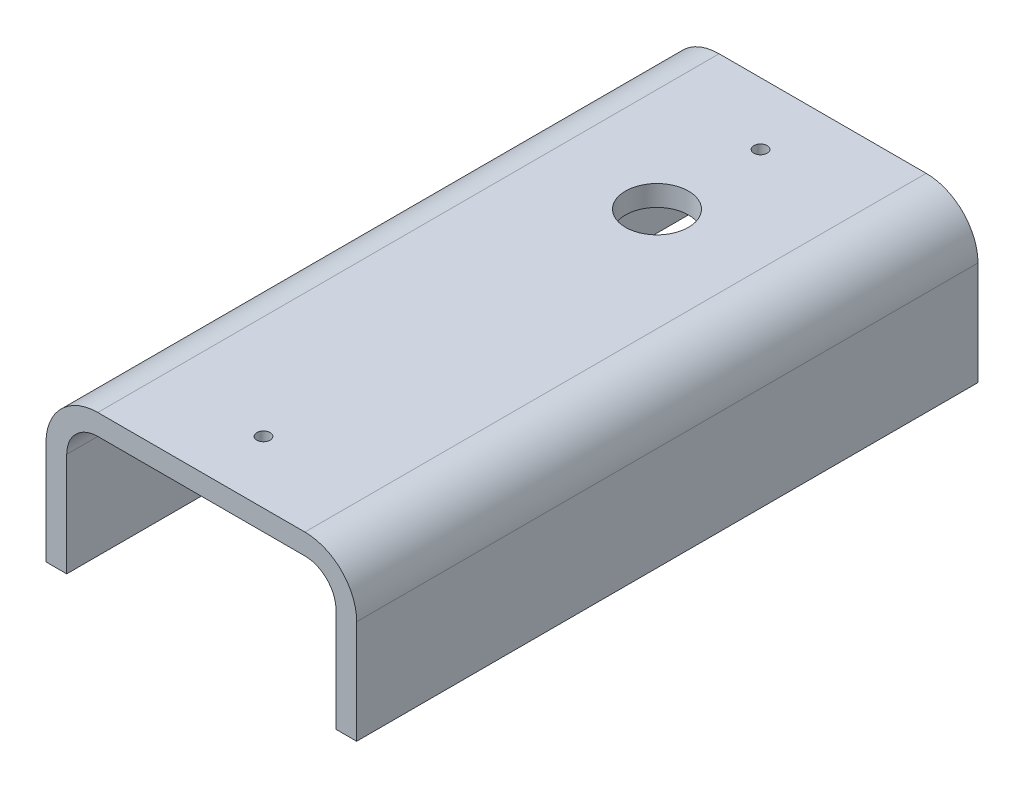
ISO-10303-21;
HEADER;
FILE_DESCRIPTION(('STEP AP214'),'2;1');
FILE_NAME('part.step','',(''),(''),'','','');
FILE_SCHEMA(('AUTOMOTIVE_DESIGN { 1 0 10303 214 1 1 1 1 }'));
ENDSEC;
DATA;
#1=APPLICATION_CONTEXT('core data for automotive mechanical design processes');
#2=APPLICATION_PROTOCOL_DEFINITION('international standard','automotive_design',2000,#1);
#3=PRODUCT_CONTEXT('',#1,'mechanical');
#4=PRODUCT('Part','Part','',(#3));
#5=PRODUCT_RELATED_PRODUCT_CATEGORY('part','',(#4));
#6=PRODUCT_DEFINITION_FORMATION('','',#4);
#7=PRODUCT_DEFINITION_CONTEXT('part definition',#1,'design');
#8=PRODUCT_DEFINITION('design','',#6,#7);
#9=PRODUCT_DEFINITION_SHAPE('','',#8);
#10=(LENGTH_UNIT() NAMED_UNIT(*) SI_UNIT(.MILLI.,.METRE.));
#11=(NAMED_UNIT(*) PLANE_ANGLE_UNIT() SI_UNIT($,.RADIAN.));
#12=(NAMED_UNIT(*) SI_UNIT($,.STERADIAN.) SOLID_ANGLE_UNIT());
#13=UNCERTAINTY_MEASURE_WITH_UNIT(LENGTH_MEASURE(1.E-05),#10,'distance_accuracy_value','');
#14=(GEOMETRIC_REPRESENTATION_CONTEXT(3) GLOBAL_UNCERTAINTY_ASSIGNED_CONTEXT((#13)) GLOBAL_UNIT_ASSIGNED_CONTEXT((#10,
#11,#12)) REPRESENTATION_CONTEXT('',''));
#15=CARTESIAN_POINT('',(0.,0.,0.));
#16=DIRECTION('',(0.,0.,1.));
#17=DIRECTION('',(1.,0.,0.));
#18=AXIS2_PLACEMENT_3D('',#15,#16,#17);
#19=CARTESIAN_POINT('',(25.,6.24999999999999,150.));
#20=DIRECTION('',(0.,0.,-1.));
#21=DIRECTION('',(-1.,0.,0.));
#22=AXIS2_PLACEMENT_3D('',#19,#20,#21);
#23=CYLINDRICAL_SURFACE('',#22,7.5);
#24=CARTESIAN_POINT('',(25.,6.24999999999999,0.));
#25=DIRECTION('',(0.,0.,1.));
#26=DIRECTION('',(1.,0.,0.));
#27=AXIS2_PLACEMENT_3D('',#24,#25,#26);
#28=CIRCLE('',#27,7.5);
#29=CARTESIAN_POINT('',(32.5,6.25,0.));
#30=VERTEX_POINT('',#29);
#31=CARTESIAN_POINT('',(25.,13.75,0.));
#32=VERTEX_POINT('',#31);
#33=EDGE_CURVE('E168',#30,#32,#28,.T.);
#34=ORIENTED_EDGE('',*,*,#33,.F.);
#35=DIRECTION('',(0.,0.,-1.));
#36=VECTOR('',#35,1.);
#37=CARTESIAN_POINT('',(32.5,6.25,150.));
#38=LINE('',#37,#36);
#39=CARTESIAN_POINT('',(32.5,6.25,150.));
#40=VERTEX_POINT('',#39);
#41=EDGE_CURVE('E11',#40,#30,#38,.T.);
#42=ORIENTED_EDGE('',*,*,#41,.F.);
#43=CARTESIAN_POINT('',(25.,6.24999999999999,150.));
#44=DIRECTION('',(0.,0.,1.));
#45=DIRECTION('',(1.,0.,0.));
#46=AXIS2_PLACEMENT_3D('',#43,#44,#45);
#47=CIRCLE('',#46,7.5);
#48=CARTESIAN_POINT('',(25.,13.75,150.));
#49=VERTEX_POINT('',#48);
#50=EDGE_CURVE('E208',#40,#49,#47,.T.);
#51=ORIENTED_EDGE('',*,*,#50,.T.);
#52=DIRECTION('',(0.,0.,-1.));
#53=VECTOR('',#52,1.);
#54=CARTESIAN_POINT('',(25.,13.75,150.));
#55=LINE('',#54,#53);
#56=EDGE_CURVE('E63',#49,#32,#55,.T.);
#57=ORIENTED_EDGE('',*,*,#56,.T.);
#58=EDGE_LOOP('',(#34,#42,#51,#57));
#59=FACE_BOUND('',#58,.T.);
#60=ADVANCED_FACE('F44',(#59),#23,.F.);
#61=CARTESIAN_POINT('',(32.5,0.,150.));
#62=DIRECTION('',(-1.,0.,0.));
#63=DIRECTION('',(0.,0.,1.));
#64=AXIS2_PLACEMENT_3D('',#61,#62,#63);
#65=PLANE('',#64);
#66=DIRECTION('',(0.,1.,0.));
#67=VECTOR('',#66,1.);
#68=CARTESIAN_POINT('',(32.5,0.,0.));
#69=LINE('',#68,#67);
#70=CARTESIAN_POINT('',(32.5,-18.75,0.));
#71=VERTEX_POINT('',#70);
#72=EDGE_CURVE('E171',#71,#30,#69,.T.);
#73=ORIENTED_EDGE('',*,*,#72,.F.);
#74=DIRECTION('',(0.,0.,-1.));
#75=VECTOR('',#74,1.);
#76=CARTESIAN_POINT('',(32.5,-18.75,150.));
#77=LINE('',#76,#75);
#78=CARTESIAN_POINT('',(32.5,-18.75,150.));
#79=VERTEX_POINT('',#78);
#80=EDGE_CURVE('E54',#79,#71,#77,.T.);
#81=ORIENTED_EDGE('',*,*,#80,.F.);
#82=DIRECTION('',(0.,1.,0.));
#83=VECTOR('',#82,1.);
#84=CARTESIAN_POINT('',(32.5,0.,150.));
#85=LINE('',#84,#83);
#86=EDGE_CURVE('E331',#79,#40,#85,.T.);
#87=ORIENTED_EDGE('',*,*,#86,.T.);
#88=ORIENTED_EDGE('',*,*,#41,.T.);
#89=EDGE_LOOP('',(#73,#81,#87,#88));
#90=FACE_BOUND('',#89,.T.);
#91=ADVANCED_FACE('F258',(#90),#65,.T.);
#92=CARTESIAN_POINT('',(0.,-18.75,150.));
#93=DIRECTION('',(0.,-1.,0.));
#94=DIRECTION('',(0.,0.,-1.));
#95=AXIS2_PLACEMENT_3D('',#92,#93,#94);
#96=PLANE('',#95);
#97=DIRECTION('',(-1.,0.,0.));
#98=VECTOR('',#97,1.);
#99=CARTESIAN_POINT('',(0.,-18.75,0.));
#100=LINE('',#99,#98);
#101=CARTESIAN_POINT('',(37.5,-18.75,0.));
#102=VERTEX_POINT('',#101);
#103=EDGE_CURVE('E176',#102,#71,#100,.T.);
#104=ORIENTED_EDGE('',*,*,#103,.F.);
#105=DIRECTION('',(0.,0.,-1.));
#106=VECTOR('',#105,1.);
#107=CARTESIAN_POINT('',(37.5,-18.75,150.));
#108=LINE('',#107,#106);
#109=CARTESIAN_POINT('',(37.5,-18.75,150.));
#110=VERTEX_POINT('',#109);
#111=EDGE_CURVE('E232',#110,#102,#108,.T.);
#112=ORIENTED_EDGE('',*,*,#111,.F.);
#113=DIRECTION('',(-1.,0.,0.));
#114=VECTOR('',#113,1.);
#115=CARTESIAN_POINT('',(0.,-18.75,150.));
#116=LINE('',#115,#114);
#117=EDGE_CURVE('E335',#110,#79,#116,.T.);
#118=ORIENTED_EDGE('',*,*,#117,.T.);
#119=ORIENTED_EDGE('',*,*,#80,.T.);
#120=EDGE_LOOP('',(#104,#112,#118,#119));
#121=FACE_BOUND('',#120,.T.);
#122=ADVANCED_FACE('F262',(#121),#96,.T.);
#123=CARTESIAN_POINT('',(37.5,0.,150.));
#124=DIRECTION('',(-1.,0.,0.));
#125=DIRECTION('',(0.,0.,1.));
#126=AXIS2_PLACEMENT_3D('',#123,#124,#125);
#127=PLANE('',#126);
#128=DIRECTION('',(0.,1.,0.));
#129=VECTOR('',#128,1.);
#130=CARTESIAN_POINT('',(37.5,0.,0.));
#131=LINE('',#130,#129);
#132=CARTESIAN_POINT('',(37.5,6.2499999999999,0.));
#133=VERTEX_POINT('',#132);
#134=EDGE_CURVE('E180',#102,#133,#131,.T.);
#135=ORIENTED_EDGE('',*,*,#134,.T.);
#136=DIRECTION('',(0.,0.,-1.));
#137=VECTOR('',#136,1.);
#138=CARTESIAN_POINT('',(37.5,6.2499999999999,150.));
#139=LINE('',#138,#137);
#140=CARTESIAN_POINT('',(37.5,6.2499999999999,150.));
#141=VERTEX_POINT('',#140);
#142=EDGE_CURVE('E228',#141,#133,#139,.T.);
#143=ORIENTED_EDGE('',*,*,#142,.F.);
#144=DIRECTION('',(0.,1.,0.));
#145=VECTOR('',#144,1.);
#146=CARTESIAN_POINT('',(37.5,0.,150.));
#147=LINE('',#146,#145);
#148=EDGE_CURVE('E339',#110,#141,#147,.T.);
#149=ORIENTED_EDGE('',*,*,#148,.F.);
#150=ORIENTED_EDGE('',*,*,#111,.T.);
#151=EDGE_LOOP('',(#135,#143,#149,#150));
#152=FACE_BOUND('',#151,.T.);
#153=ADVANCED_FACE('F267',(#152),#127,.F.);
#154=CARTESIAN_POINT('',(25.,6.24999999999999,150.));
#155=DIRECTION('',(0.,0.,-1.));
#156=DIRECTION('',(-1.,0.,0.));
#157=AXIS2_PLACEMENT_3D('',#154,#155,#156);
#158=CYLINDRICAL_SURFACE('',#157,12.5);
#159=CARTESIAN_POINT('',(25.,6.24999999999999,0.));
#160=DIRECTION('',(0.,0.,1.));
#161=DIRECTION('',(1.,0.,0.));
#162=AXIS2_PLACEMENT_3D('',#159,#160,#161);
#163=CIRCLE('',#162,12.5);
#164=CARTESIAN_POINT('',(24.9999999999999,18.75,0.));
#165=VERTEX_POINT('',#164);
#166=EDGE_CURVE('E184',#133,#165,#163,.T.);
#167=ORIENTED_EDGE('',*,*,#166,.T.);
#168=DIRECTION('',(0.,0.,-1.));
#169=VECTOR('',#168,1.);
#170=CARTESIAN_POINT('',(24.9999999999999,18.75,150.));
#171=LINE('',#170,#169);
#172=CARTESIAN_POINT('',(24.9999999999999,18.75,150.));
#173=VERTEX_POINT('',#172);
#174=EDGE_CURVE('E224',#173,#165,#171,.T.);
#175=ORIENTED_EDGE('',*,*,#174,.F.);
#176=CARTESIAN_POINT('',(25.,6.24999999999999,150.));
#177=DIRECTION('',(0.,0.,1.));
#178=DIRECTION('',(1.,0.,0.));
#179=AXIS2_PLACEMENT_3D('',#176,#177,#178);
#180=CIRCLE('',#179,12.5);
#181=EDGE_CURVE('E342',#141,#173,#180,.T.);
#182=ORIENTED_EDGE('',*,*,#181,.F.);
#183=ORIENTED_EDGE('',*,*,#142,.T.);
#184=EDGE_LOOP('',(#167,#175,#182,#183));
#185=FACE_BOUND('',#184,.T.);
#186=ADVANCED_FACE('F274',(#185),#158,.T.);
#187=CARTESIAN_POINT('',(0.,18.75,150.));
#188=DIRECTION('',(0.,-1.,0.));
#189=DIRECTION('',(0.,0.,-1.));
#190=AXIS2_PLACEMENT_3D('',#187,#188,#189);
#191=PLANE('',#190);
#192=CARTESIAN_POINT('',(0.,18.75,40.));
#193=DIRECTION('',(0.,1.,0.));
#194=DIRECTION('',(0.,0.,1.));
#195=AXIS2_PLACEMENT_3D('',#192,#193,#194);
#196=CIRCLE('',#195,7.6);
#197=CARTESIAN_POINT('',(0.,18.75,47.6));
#198=VERTEX_POINT('',#197);
#199=EDGE_CURVE('E317',#198,#198,#196,.T.);
#200=ORIENTED_EDGE('',*,*,#199,.F.);
#201=EDGE_LOOP('',(#200));
#202=FACE_BOUND('',#201,.T.);
#203=CARTESIAN_POINT('',(0.,18.75,135.));
#204=DIRECTION('',(0.,1.,0.));
#205=DIRECTION('',(0.,0.,1.));
#206=AXIS2_PLACEMENT_3D('',#203,#204,#205);
#207=CIRCLE('',#206,1.6);
#208=CARTESIAN_POINT('',(0.,18.75,136.6));
#209=VERTEX_POINT('',#208);
#210=EDGE_CURVE('E240',#209,#209,#207,.T.);
#211=ORIENTED_EDGE('',*,*,#210,.F.);
#212=EDGE_LOOP('',(#211));
#213=FACE_BOUND('',#212,.T.);
#214=CARTESIAN_POINT('',(0.,18.75,15.));
#215=DIRECTION('',(0.,1.,0.));
#216=DIRECTION('',(0.,0.,1.));
#217=AXIS2_PLACEMENT_3D('',#214,#215,#216);
#218=CIRCLE('',#217,1.6);
#219=CARTESIAN_POINT('',(0.,18.75,16.6));
#220=VERTEX_POINT('',#219);
#221=EDGE_CURVE('E321',#220,#220,#218,.T.);
#222=ORIENTED_EDGE('',*,*,#221,.F.);
#223=EDGE_LOOP('',(#222));
#224=FACE_BOUND('',#223,.T.);
#225=DIRECTION('',(-1.,0.,0.));
#226=VECTOR('',#225,1.);
#227=CARTESIAN_POINT('',(0.,18.75,0.));
#228=LINE('',#227,#226);
#229=CARTESIAN_POINT('',(-24.9999999999999,18.75,0.));
#230=VERTEX_POINT('',#229);
#231=EDGE_CURVE('E187',#165,#230,#228,.T.);
#232=ORIENTED_EDGE('',*,*,#231,.T.);
#233=DIRECTION('',(0.,0.,-1.));
#234=VECTOR('',#233,1.);
#235=CARTESIAN_POINT('',(-24.9999999999999,18.75,150.));
#236=LINE('',#235,#234);
#237=CARTESIAN_POINT('',(-24.9999999999999,18.75,150.));
#238=VERTEX_POINT('',#237);
#239=EDGE_CURVE('E221',#238,#230,#236,.T.);
#240=ORIENTED_EDGE('',*,*,#239,.F.);
#241=DIRECTION('',(-1.,0.,0.));
#242=VECTOR('',#241,1.);
#243=CARTESIAN_POINT('',(0.,18.75,150.));
#244=LINE('',#243,#242);
#245=EDGE_CURVE('E345',#173,#238,#244,.T.);
#246=ORIENTED_EDGE('',*,*,#245,.F.);
#247=ORIENTED_EDGE('',*,*,#174,.T.);
#248=EDGE_LOOP('',(#232,#240,#246,#247));
#249=FACE_BOUND('',#248,.T.);
#250=ADVANCED_FACE('F278',(#202,#213,#224,#249),#191,.F.);
#251=CARTESIAN_POINT('',(-25.,6.24999999999999,150.));
#252=DIRECTION('',(0.,0.,-1.));
#253=DIRECTION('',(-1.,0.,0.));
#254=AXIS2_PLACEMENT_3D('',#251,#252,#253);
#255=CYLINDRICAL_SURFACE('',#254,12.5);
#256=CARTESIAN_POINT('',(-25.,6.24999999999999,0.));
#257=DIRECTION('',(0.,0.,1.));
#258=DIRECTION('',(1.,0.,0.));
#259=AXIS2_PLACEMENT_3D('',#256,#257,#258);
#260=CIRCLE('',#259,12.5);
#261=CARTESIAN_POINT('',(-37.5,6.2499999999999,0.));
#262=VERTEX_POINT('',#261);
#263=EDGE_CURVE('E191',#262,#230,#260,.F.);
#264=ORIENTED_EDGE('',*,*,#263,.F.);
#265=DIRECTION('',(0.,0.,-1.));
#266=VECTOR('',#265,1.);
#267=CARTESIAN_POINT('',(-37.5,6.2499999999999,150.));
#268=LINE('',#267,#266);
#269=CARTESIAN_POINT('',(-37.5,6.2499999999999,150.));
#270=VERTEX_POINT('',#269);
#271=EDGE_CURVE('E218',#270,#262,#268,.T.);
#272=ORIENTED_EDGE('',*,*,#271,.F.);
#273=CARTESIAN_POINT('',(-25.,6.24999999999999,150.));
#274=DIRECTION('',(0.,0.,1.));
#275=DIRECTION('',(1.,0.,0.));
#276=AXIS2_PLACEMENT_3D('',#273,#274,#275);
#277=CIRCLE('',#276,12.5);
#278=EDGE_CURVE('E348',#270,#238,#277,.F.);
#279=ORIENTED_EDGE('',*,*,#278,.T.);
#280=ORIENTED_EDGE('',*,*,#239,.T.);
#281=EDGE_LOOP('',(#264,#272,#279,#280));
#282=FACE_BOUND('',#281,.T.);
#283=ADVANCED_FACE('F282',(#282),#255,.T.);
#284=CARTESIAN_POINT('',(-37.5,0.,150.));
#285=DIRECTION('',(-1.,0.,0.));
#286=DIRECTION('',(0.,0.,1.));
#287=AXIS2_PLACEMENT_3D('',#284,#285,#286);
#288=PLANE('',#287);
#289=DIRECTION('',(0.,1.,0.));
#290=VECTOR('',#289,1.);
#291=CARTESIAN_POINT('',(-37.5,0.,0.));
#292=LINE('',#291,#290);
#293=CARTESIAN_POINT('',(-37.5,-18.75,0.));
#294=VERTEX_POINT('',#293);
#295=EDGE_CURVE('E195',#294,#262,#292,.T.);
#296=ORIENTED_EDGE('',*,*,#295,.F.);
#297=DIRECTION('',(0.,0.,-1.));
#298=VECTOR('',#297,1.);
#299=CARTESIAN_POINT('',(-37.5,-18.75,150.));
#300=LINE('',#299,#298);
#301=CARTESIAN_POINT('',(-37.5,-18.75,150.));
#302=VERTEX_POINT('',#301);
#303=EDGE_CURVE('E215',#302,#294,#300,.T.);
#304=ORIENTED_EDGE('',*,*,#303,.F.);
#305=DIRECTION('',(0.,1.,0.));
#306=VECTOR('',#305,1.);
#307=CARTESIAN_POINT('',(-37.5,0.,150.));
#308=LINE('',#307,#306);
#309=EDGE_CURVE('E351',#302,#270,#308,.T.);
#310=ORIENTED_EDGE('',*,*,#309,.T.);
#311=ORIENTED_EDGE('',*,*,#271,.T.);
#312=EDGE_LOOP('',(#296,#304,#310,#311));
#313=FACE_BOUND('',#312,.T.);
#314=ADVANCED_FACE('F286',(#313),#288,.T.);
#315=CARTESIAN_POINT('',(-32.5,-18.75,0.));
#316=VERTEX_POINT('',#315);
#317=EDGE_CURVE('E181',#316,#294,#100,.T.);
#318=ORIENTED_EDGE('',*,*,#317,.F.);
#319=DIRECTION('',(0.,0.,-1.));
#320=VECTOR('',#319,1.);
#321=CARTESIAN_POINT('',(-32.5,-18.75,150.));
#322=LINE('',#321,#320);
#323=CARTESIAN_POINT('',(-32.5,-18.75,150.));
#324=VERTEX_POINT('',#323);
#325=EDGE_CURVE('E158',#324,#316,#322,.T.);
#326=ORIENTED_EDGE('',*,*,#325,.F.);
#327=EDGE_CURVE('E146',#324,#302,#116,.T.);
#328=ORIENTED_EDGE('',*,*,#327,.T.);
#329=ORIENTED_EDGE('',*,*,#303,.T.);
#330=EDGE_LOOP('',(#318,#326,#328,#329));
#331=FACE_BOUND('',#330,.T.);
#332=ADVANCED_FACE('F270',(#331),#96,.T.);
#333=CARTESIAN_POINT('',(-32.5,0.,150.));
#334=DIRECTION('',(-1.,0.,0.));
#335=DIRECTION('',(0.,0.,1.));
#336=AXIS2_PLACEMENT_3D('',#333,#334,#335);
#337=PLANE('',#336);
#338=DIRECTION('',(0.,1.,0.));
#339=VECTOR('',#338,1.);
#340=CARTESIAN_POINT('',(-32.5,0.,0.));
#341=LINE('',#340,#339);
#342=CARTESIAN_POINT('',(-32.5,6.25,0.));
#343=VERTEX_POINT('',#342);
#344=EDGE_CURVE('E154',#316,#343,#341,.T.);
#345=ORIENTED_EDGE('',*,*,#344,.T.);
#346=DIRECTION('',(0.,0.,-1.));
#347=VECTOR('',#346,1.);
#348=CARTESIAN_POINT('',(-32.5,6.25,150.));
#349=LINE('',#348,#347);
#350=CARTESIAN_POINT('',(-32.5,6.25,150.));
#351=VERTEX_POINT('',#350);
#352=EDGE_CURVE('E151',#351,#343,#349,.T.);
#353=ORIENTED_EDGE('',*,*,#352,.F.);
#354=DIRECTION('',(0.,1.,0.));
#355=VECTOR('',#354,1.);
#356=CARTESIAN_POINT('',(-32.5,0.,150.));
#357=LINE('',#356,#355);
#358=EDGE_CURVE('E138',#324,#351,#357,.T.);
#359=ORIENTED_EDGE('',*,*,#358,.F.);
#360=ORIENTED_EDGE('',*,*,#325,.T.);
#361=EDGE_LOOP('',(#345,#353,#359,#360));
#362=FACE_BOUND('',#361,.T.);
#363=ADVANCED_FACE('F152',(#362),#337,.F.);
#364=CARTESIAN_POINT('',(-25.,6.24999999999999,150.));
#365=DIRECTION('',(0.,0.,-1.));
#366=DIRECTION('',(-1.,0.,0.));
#367=AXIS2_PLACEMENT_3D('',#364,#365,#366);
#368=CYLINDRICAL_SURFACE('',#367,7.50000000000001);
#369=CARTESIAN_POINT('',(-25.,6.24999999999999,0.));
#370=DIRECTION('',(0.,0.,1.));
#371=DIRECTION('',(1.,0.,0.));
#372=AXIS2_PLACEMENT_3D('',#369,#370,#371);
#373=CIRCLE('',#372,7.50000000000001);
#374=CARTESIAN_POINT('',(-25.,13.75,0.));
#375=VERTEX_POINT('',#374);
#376=EDGE_CURVE('E201',#343,#375,#373,.F.);
#377=ORIENTED_EDGE('',*,*,#376,.T.);
#378=DIRECTION('',(0.,0.,-1.));
#379=VECTOR('',#378,1.);
#380=CARTESIAN_POINT('',(-25.,13.75,150.));
#381=LINE('',#380,#379);
#382=CARTESIAN_POINT('',(-25.,13.75,150.));
#383=VERTEX_POINT('',#382);
#384=EDGE_CURVE('E101',#383,#375,#381,.T.);
#385=ORIENTED_EDGE('',*,*,#384,.F.);
#386=CARTESIAN_POINT('',(-25.,6.24999999999999,150.));
#387=DIRECTION('',(0.,0.,1.));
#388=DIRECTION('',(1.,0.,0.));
#389=AXIS2_PLACEMENT_3D('',#386,#387,#388);
#390=CIRCLE('',#389,7.50000000000001);
#391=EDGE_CURVE('E143',#351,#383,#390,.F.);
#392=ORIENTED_EDGE('',*,*,#391,.F.);
#393=ORIENTED_EDGE('',*,*,#352,.T.);
#394=EDGE_LOOP('',(#377,#385,#392,#393));
#395=FACE_BOUND('',#394,.T.);
#396=ADVANCED_FACE('F160',(#395),#368,.F.);
#397=CARTESIAN_POINT('',(0.,13.75,150.));
#398=DIRECTION('',(0.,-1.,0.));
#399=DIRECTION('',(0.,0.,-1.));
#400=AXIS2_PLACEMENT_3D('',#397,#398,#399);
#401=PLANE('',#400);
#402=CARTESIAN_POINT('',(0.,13.75,40.));
#403=DIRECTION('',(0.,-1.,0.));
#404=DIRECTION('',(0.,0.,-1.));
#405=AXIS2_PLACEMENT_3D('',#402,#403,#404);
#406=CIRCLE('',#405,7.6);
#407=CARTESIAN_POINT('',(0.,13.75,32.4));
#408=VERTEX_POINT('',#407);
#409=EDGE_CURVE('E47',#408,#408,#406,.T.);
#410=ORIENTED_EDGE('',*,*,#409,.F.);
#411=EDGE_LOOP('',(#410));
#412=FACE_BOUND('',#411,.T.);
#413=CARTESIAN_POINT('',(0.,13.75,135.));
#414=DIRECTION('',(0.,-1.,0.));
#415=DIRECTION('',(0.,0.,-1.));
#416=AXIS2_PLACEMENT_3D('',#413,#414,#415);
#417=CIRCLE('',#416,1.6);
#418=CARTESIAN_POINT('',(0.,13.75,133.4));
#419=VERTEX_POINT('',#418);
#420=EDGE_CURVE('E172',#419,#419,#417,.T.);
#421=ORIENTED_EDGE('',*,*,#420,.F.);
#422=EDGE_LOOP('',(#421));
#423=FACE_BOUND('',#422,.T.);
#424=CARTESIAN_POINT('',(0.,13.75,15.));
#425=DIRECTION('',(0.,-1.,0.));
#426=DIRECTION('',(0.,0.,-1.));
#427=AXIS2_PLACEMENT_3D('',#424,#425,#426);
#428=CIRCLE('',#427,1.6);
#429=CARTESIAN_POINT('',(0.,13.75,13.4));
#430=VERTEX_POINT('',#429);
#431=EDGE_CURVE('E237',#430,#430,#428,.T.);
#432=ORIENTED_EDGE('',*,*,#431,.F.);
#433=EDGE_LOOP('',(#432));
#434=FACE_BOUND('',#433,.T.);
#435=DIRECTION('',(-1.,0.,0.));
#436=VECTOR('',#435,1.);
#437=CARTESIAN_POINT('',(0.,13.75,0.));
#438=LINE('',#437,#436);
#439=EDGE_CURVE('E204',#32,#375,#438,.T.);
#440=ORIENTED_EDGE('',*,*,#439,.F.);
#441=ORIENTED_EDGE('',*,*,#56,.F.);
#442=DIRECTION('',(-1.,0.,0.));
#443=VECTOR('',#442,1.);
#444=CARTESIAN_POINT('',(0.,13.75,150.));
#445=LINE('',#444,#443);
#446=EDGE_CURVE('E162',#49,#383,#445,.T.);
#447=ORIENTED_EDGE('',*,*,#446,.T.);
#448=ORIENTED_EDGE('',*,*,#384,.T.);
#449=EDGE_LOOP('',(#440,#441,#447,#448));
#450=FACE_BOUND('',#449,.T.);
#451=ADVANCED_FACE('F248',(#412,#423,#434,#450),#401,.T.);
#452=CARTESIAN_POINT('',(0.,0.,150.));
#453=DIRECTION('',(0.,0.,1.));
#454=DIRECTION('',(1.,0.,0.));
#455=AXIS2_PLACEMENT_3D('',#452,#453,#454);
#456=PLANE('',#455);
#457=ORIENTED_EDGE('',*,*,#50,.F.);
#458=ORIENTED_EDGE('',*,*,#86,.F.);
#459=ORIENTED_EDGE('',*,*,#117,.F.);
#460=ORIENTED_EDGE('',*,*,#148,.T.);
#461=ORIENTED_EDGE('',*,*,#181,.T.);
#462=ORIENTED_EDGE('',*,*,#245,.T.);
#463=ORIENTED_EDGE('',*,*,#278,.F.);
#464=ORIENTED_EDGE('',*,*,#309,.F.);
#465=ORIENTED_EDGE('',*,*,#327,.F.);
#466=ORIENTED_EDGE('',*,*,#358,.T.);
#467=ORIENTED_EDGE('',*,*,#391,.T.);
#468=ORIENTED_EDGE('',*,*,#446,.F.);
#469=EDGE_LOOP('',(#457,#458,#459,#460,#461,#462,#463,#464,#465,#466,#467,#468));
#470=FACE_BOUND('',#469,.T.);
#471=ADVANCED_FACE('F140',(#470),#456,.T.);
#472=CARTESIAN_POINT('',(0.,0.,0.));
#473=DIRECTION('',(0.,0.,1.));
#474=DIRECTION('',(1.,0.,0.));
#475=AXIS2_PLACEMENT_3D('',#472,#473,#474);
#476=PLANE('',#475);
#477=ORIENTED_EDGE('',*,*,#33,.T.);
#478=ORIENTED_EDGE('',*,*,#439,.T.);
#479=ORIENTED_EDGE('',*,*,#376,.F.);
#480=ORIENTED_EDGE('',*,*,#344,.F.);
#481=ORIENTED_EDGE('',*,*,#317,.T.);
#482=ORIENTED_EDGE('',*,*,#295,.T.);
#483=ORIENTED_EDGE('',*,*,#263,.T.);
#484=ORIENTED_EDGE('',*,*,#231,.F.);
#485=ORIENTED_EDGE('',*,*,#166,.F.);
#486=ORIENTED_EDGE('',*,*,#134,.F.);
#487=ORIENTED_EDGE('',*,*,#103,.T.);
#488=ORIENTED_EDGE('',*,*,#72,.T.);
#489=EDGE_LOOP('',(#477,#478,#479,#480,#481,#482,#483,#484,#485,#486,#487,#488));
#490=FACE_BOUND('',#489,.T.);
#491=ADVANCED_FACE('F255',(#490),#476,.F.);
#492=CARTESIAN_POINT('',(0.,-18.75,15.));
#493=DIRECTION('',(0.,1.,0.));
#494=DIRECTION('',(0.,0.,1.));
#495=AXIS2_PLACEMENT_3D('',#492,#493,#494);
#496=CYLINDRICAL_SURFACE('',#495,1.6);
#497=ORIENTED_EDGE('',*,*,#431,.T.);
#498=EDGE_LOOP('',(#497));
#499=FACE_BOUND('',#498,.T.);
#500=ORIENTED_EDGE('',*,*,#221,.T.);
#501=EDGE_LOOP('',(#500));
#502=FACE_BOUND('',#501,.T.);
#503=ADVANCED_FACE('F299',(#499,#502),#496,.F.);
#504=CARTESIAN_POINT('',(0.,-18.75,135.));
#505=DIRECTION('',(0.,1.,0.));
#506=DIRECTION('',(0.,0.,1.));
#507=AXIS2_PLACEMENT_3D('',#504,#505,#506);
#508=CYLINDRICAL_SURFACE('',#507,1.6);
#509=ORIENTED_EDGE('',*,*,#420,.T.);
#510=EDGE_LOOP('',(#509));
#511=FACE_BOUND('',#510,.T.);
#512=ORIENTED_EDGE('',*,*,#210,.T.);
#513=EDGE_LOOP('',(#512));
#514=FACE_BOUND('',#513,.T.);
#515=ADVANCED_FACE('F245',(#511,#514),#508,.F.);
#516=CARTESIAN_POINT('',(0.,-18.75,40.));
#517=DIRECTION('',(0.,1.,0.));
#518=DIRECTION('',(0.,0.,1.));
#519=AXIS2_PLACEMENT_3D('',#516,#517,#518);
#520=CYLINDRICAL_SURFACE('',#519,7.6);
#521=ORIENTED_EDGE('',*,*,#409,.T.);
#522=EDGE_LOOP('',(#521));
#523=FACE_BOUND('',#522,.T.);
#524=ORIENTED_EDGE('',*,*,#199,.T.);
#525=EDGE_LOOP('',(#524));
#526=FACE_BOUND('',#525,.T.);
#527=ADVANCED_FACE('F307',(#523,#526),#520,.F.);
#528=CLOSED_SHELL('',(#60,#91,#122,#153,#186,#250,#283,#314,#332,#363,#396,#451,#471,#491,#503,
#515,#527));
#529=MANIFOLD_SOLID_BREP('B2',#528);
#530=ADVANCED_BREP_SHAPE_REPRESENTATION('',(#18,#529),#14);
#531=SHAPE_DEFINITION_REPRESENTATION(#9,#530);
ENDSEC;
END-ISO-10303-21;
